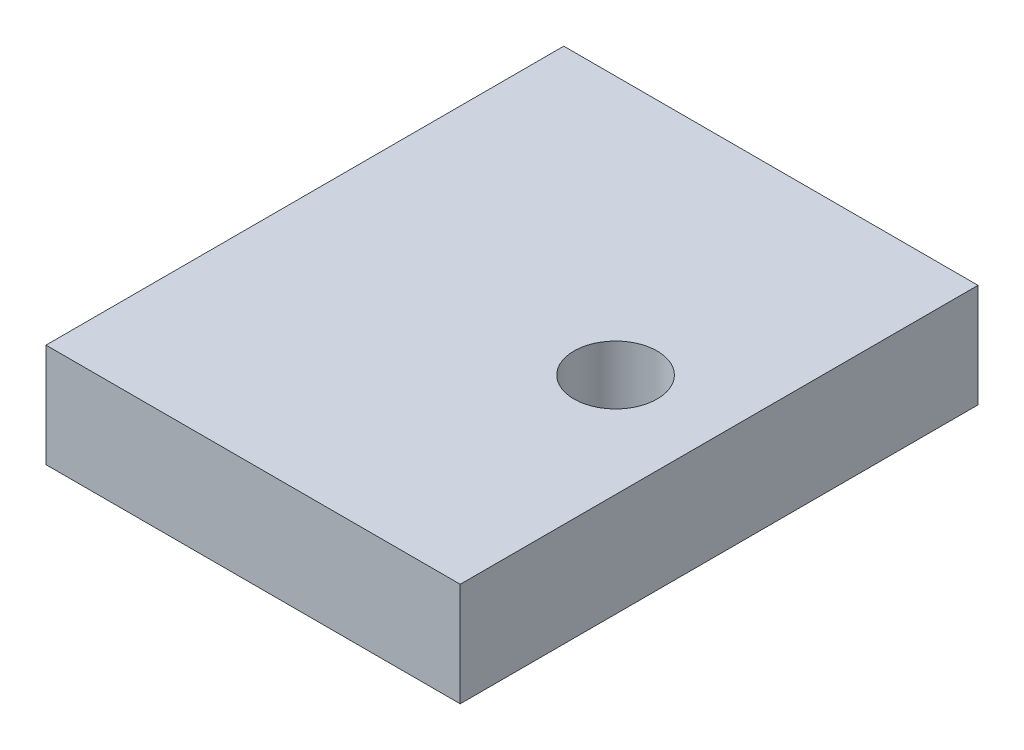
ISO-10303-21;
HEADER;
FILE_DESCRIPTION(('STEP AP214'),'2;1');
FILE_NAME('part.step','',(''),(''),'','','');
FILE_SCHEMA(('AUTOMOTIVE_DESIGN { 1 0 10303 214 1 1 1 1 }'));
ENDSEC;
DATA;
#1=APPLICATION_CONTEXT('core data for automotive mechanical design processes');
#2=APPLICATION_PROTOCOL_DEFINITION('international standard','automotive_design',2000,#1);
#3=PRODUCT_CONTEXT('',#1,'mechanical');
#4=PRODUCT('Part','Part','',(#3));
#5=PRODUCT_RELATED_PRODUCT_CATEGORY('part','',(#4));
#6=PRODUCT_DEFINITION_FORMATION('','',#4);
#7=PRODUCT_DEFINITION_CONTEXT('part definition',#1,'design');
#8=PRODUCT_DEFINITION('design','',#6,#7);
#9=PRODUCT_DEFINITION_SHAPE('','',#8);
#10=(LENGTH_UNIT() NAMED_UNIT(*) SI_UNIT(.MILLI.,.METRE.));
#11=(NAMED_UNIT(*) PLANE_ANGLE_UNIT() SI_UNIT($,.RADIAN.));
#12=(NAMED_UNIT(*) SI_UNIT($,.STERADIAN.) SOLID_ANGLE_UNIT());
#13=UNCERTAINTY_MEASURE_WITH_UNIT(LENGTH_MEASURE(1.E-05),#10,'distance_accuracy_value','');
#14=(GEOMETRIC_REPRESENTATION_CONTEXT(3) GLOBAL_UNCERTAINTY_ASSIGNED_CONTEXT((#13)) GLOBAL_UNIT_ASSIGNED_CONTEXT((#10,
#11,#12)) REPRESENTATION_CONTEXT('',''));
#15=CARTESIAN_POINT('',(0.,0.,0.));
#16=DIRECTION('',(0.,0.,1.));
#17=DIRECTION('',(1.,0.,0.));
#18=AXIS2_PLACEMENT_3D('',#15,#16,#17);
#19=CARTESIAN_POINT('',(25.4,6.35,0.));
#20=DIRECTION('',(1.,0.,0.));
#21=DIRECTION('',(0.,0.,-1.));
#22=AXIS2_PLACEMENT_3D('',#19,#20,#21);
#23=PLANE('',#22);
#24=DIRECTION('',(0.,0.,1.));
#25=VECTOR('',#24,1.);
#26=CARTESIAN_POINT('',(25.4,0.,0.));
#27=LINE('',#26,#25);
#28=CARTESIAN_POINT('',(25.4,0.,-31.75));
#29=VERTEX_POINT('',#28);
#30=CARTESIAN_POINT('',(25.4,0.,0.));
#31=VERTEX_POINT('',#30);
#32=EDGE_CURVE('E99',#29,#31,#27,.T.);
#33=ORIENTED_EDGE('',*,*,#32,.F.);
#34=DIRECTION('',(0.,-1.,0.));
#35=VECTOR('',#34,1.);
#36=CARTESIAN_POINT('',(25.4,6.35,-31.75));
#37=LINE('',#36,#35);
#38=CARTESIAN_POINT('',(25.4,6.35,-31.75));
#39=VERTEX_POINT('',#38);
#40=EDGE_CURVE('E11',#39,#29,#37,.T.);
#41=ORIENTED_EDGE('',*,*,#40,.F.);
#42=DIRECTION('',(0.,0.,1.));
#43=VECTOR('',#42,1.);
#44=CARTESIAN_POINT('',(25.4,6.35,0.));
#45=LINE('',#44,#43);
#46=CARTESIAN_POINT('',(25.4,6.35,0.));
#47=VERTEX_POINT('',#46);
#48=EDGE_CURVE('E92',#39,#47,#45,.T.);
#49=ORIENTED_EDGE('',*,*,#48,.T.);
#50=DIRECTION('',(0.,-1.,0.));
#51=VECTOR('',#50,1.);
#52=CARTESIAN_POINT('',(25.4,6.35,0.));
#53=LINE('',#52,#51);
#54=EDGE_CURVE('E74',#47,#31,#53,.T.);
#55=ORIENTED_EDGE('',*,*,#54,.T.);
#56=EDGE_LOOP('',(#33,#41,#49,#55));
#57=FACE_BOUND('',#56,.T.);
#58=ADVANCED_FACE('F36',(#57),#23,.T.);
#59=CARTESIAN_POINT('',(0.,6.35,-31.75));
#60=DIRECTION('',(0.,0.,-1.));
#61=DIRECTION('',(-1.,0.,0.));
#62=AXIS2_PLACEMENT_3D('',#59,#60,#61);
#63=PLANE('',#62);
#64=DIRECTION('',(1.,0.,0.));
#65=VECTOR('',#64,1.);
#66=CARTESIAN_POINT('',(0.,0.,-31.75));
#67=LINE('',#66,#65);
#68=CARTESIAN_POINT('',(0.,0.,-31.75));
#69=VERTEX_POINT('',#68);
#70=EDGE_CURVE('E85',#69,#29,#67,.T.);
#71=ORIENTED_EDGE('',*,*,#70,.F.);
#72=DIRECTION('',(0.,-1.,0.));
#73=VECTOR('',#72,1.);
#74=CARTESIAN_POINT('',(0.,6.35,-31.75));
#75=LINE('',#74,#73);
#76=CARTESIAN_POINT('',(0.,6.35,-31.75));
#77=VERTEX_POINT('',#76);
#78=EDGE_CURVE('E44',#77,#69,#75,.T.);
#79=ORIENTED_EDGE('',*,*,#78,.F.);
#80=DIRECTION('',(1.,0.,0.));
#81=VECTOR('',#80,1.);
#82=CARTESIAN_POINT('',(0.,6.35,-31.75));
#83=LINE('',#82,#81);
#84=EDGE_CURVE('E83',#77,#39,#83,.T.);
#85=ORIENTED_EDGE('',*,*,#84,.T.);
#86=ORIENTED_EDGE('',*,*,#40,.T.);
#87=EDGE_LOOP('',(#71,#79,#85,#86));
#88=FACE_BOUND('',#87,.T.);
#89=ADVANCED_FACE('F82',(#88),#63,.T.);
#90=CARTESIAN_POINT('',(0.,6.35,0.));
#91=DIRECTION('',(-1.,0.,0.));
#92=DIRECTION('',(0.,0.,1.));
#93=AXIS2_PLACEMENT_3D('',#90,#91,#92);
#94=PLANE('',#93);
#95=DIRECTION('',(0.,0.,-1.));
#96=VECTOR('',#95,1.);
#97=CARTESIAN_POINT('',(0.,0.,0.));
#98=LINE('',#97,#96);
#99=CARTESIAN_POINT('',(0.,0.,0.));
#100=VERTEX_POINT('',#99);
#101=EDGE_CURVE('E104',#100,#69,#98,.T.);
#102=ORIENTED_EDGE('',*,*,#101,.F.);
#103=DIRECTION('',(0.,-1.,0.));
#104=VECTOR('',#103,1.);
#105=CARTESIAN_POINT('',(0.,6.35,0.));
#106=LINE('',#105,#104);
#107=CARTESIAN_POINT('',(0.,6.35,0.));
#108=VERTEX_POINT('',#107);
#109=EDGE_CURVE('E67',#108,#100,#106,.T.);
#110=ORIENTED_EDGE('',*,*,#109,.F.);
#111=DIRECTION('',(0.,0.,-1.));
#112=VECTOR('',#111,1.);
#113=CARTESIAN_POINT('',(0.,6.35,0.));
#114=LINE('',#113,#112);
#115=EDGE_CURVE('E91',#108,#77,#114,.T.);
#116=ORIENTED_EDGE('',*,*,#115,.T.);
#117=ORIENTED_EDGE('',*,*,#78,.T.);
#118=EDGE_LOOP('',(#102,#110,#116,#117));
#119=FACE_BOUND('',#118,.T.);
#120=ADVANCED_FACE('F94',(#119),#94,.T.);
#121=CARTESIAN_POINT('',(0.,6.35,0.));
#122=DIRECTION('',(0.,0.,-1.));
#123=DIRECTION('',(-1.,0.,0.));
#124=AXIS2_PLACEMENT_3D('',#121,#122,#123);
#125=PLANE('',#124);
#126=DIRECTION('',(1.,0.,0.));
#127=VECTOR('',#126,1.);
#128=CARTESIAN_POINT('',(0.,0.,0.));
#129=LINE('',#128,#127);
#130=EDGE_CURVE('E106',#100,#31,#129,.T.);
#131=ORIENTED_EDGE('',*,*,#130,.T.);
#132=ORIENTED_EDGE('',*,*,#54,.F.);
#133=DIRECTION('',(1.,0.,0.));
#134=VECTOR('',#133,1.);
#135=CARTESIAN_POINT('',(0.,6.35,0.));
#136=LINE('',#135,#134);
#137=EDGE_CURVE('E52',#108,#47,#136,.T.);
#138=ORIENTED_EDGE('',*,*,#137,.F.);
#139=ORIENTED_EDGE('',*,*,#109,.T.);
#140=EDGE_LOOP('',(#131,#132,#138,#139));
#141=FACE_BOUND('',#140,.T.);
#142=ADVANCED_FACE('F121',(#141),#125,.F.);
#143=CARTESIAN_POINT('',(0.,6.35,0.));
#144=DIRECTION('',(0.,1.,0.));
#145=DIRECTION('',(0.,0.,1.));
#146=AXIS2_PLACEMENT_3D('',#143,#144,#145);
#147=PLANE('',#146);
#148=CARTESIAN_POINT('',(19.05,6.35,-15.875));
#149=DIRECTION('',(0.,1.,0.));
#150=DIRECTION('',(0.,0.,1.));
#151=AXIS2_PLACEMENT_3D('',#148,#149,#150);
#152=CIRCLE('',#151,2.55269999999999);
#153=CARTESIAN_POINT('',(19.05,6.35,-13.3223));
#154=VERTEX_POINT('',#153);
#155=EDGE_CURVE('E112',#154,#154,#152,.T.);
#156=ORIENTED_EDGE('',*,*,#155,.F.);
#157=EDGE_LOOP('',(#156));
#158=FACE_BOUND('',#157,.T.);
#159=ORIENTED_EDGE('',*,*,#48,.F.);
#160=ORIENTED_EDGE('',*,*,#84,.F.);
#161=ORIENTED_EDGE('',*,*,#115,.F.);
#162=ORIENTED_EDGE('',*,*,#137,.T.);
#163=EDGE_LOOP('',(#159,#160,#161,#162));
#164=FACE_BOUND('',#163,.T.);
#165=ADVANCED_FACE('F90',(#158,#164),#147,.T.);
#166=CARTESIAN_POINT('',(0.,0.,0.));
#167=DIRECTION('',(0.,1.,0.));
#168=DIRECTION('',(0.,0.,1.));
#169=AXIS2_PLACEMENT_3D('',#166,#167,#168);
#170=PLANE('',#169);
#171=CARTESIAN_POINT('',(19.05,0.,-15.875));
#172=DIRECTION('',(0.,1.,0.));
#173=DIRECTION('',(0.,0.,1.));
#174=AXIS2_PLACEMENT_3D('',#171,#172,#173);
#175=CIRCLE('',#174,2.55269999999999);
#176=CARTESIAN_POINT('',(19.05,0.,-13.3223));
#177=VERTEX_POINT('',#176);
#178=EDGE_CURVE('E102',#177,#177,#175,.T.);
#179=ORIENTED_EDGE('',*,*,#178,.T.);
#180=EDGE_LOOP('',(#179));
#181=FACE_BOUND('',#180,.T.);
#182=ORIENTED_EDGE('',*,*,#32,.T.);
#183=ORIENTED_EDGE('',*,*,#130,.F.);
#184=ORIENTED_EDGE('',*,*,#101,.T.);
#185=ORIENTED_EDGE('',*,*,#70,.T.);
#186=EDGE_LOOP('',(#182,#183,#184,#185));
#187=FACE_BOUND('',#186,.T.);
#188=ADVANCED_FACE('F120',(#181,#187),#170,.F.);
#189=CARTESIAN_POINT('',(19.05,6.35,-15.875));
#190=DIRECTION('',(0.,1.,0.));
#191=DIRECTION('',(0.,0.,1.));
#192=AXIS2_PLACEMENT_3D('',#189,#190,#191);
#193=CYLINDRICAL_SURFACE('',#192,2.55269999999999);
#194=ORIENTED_EDGE('',*,*,#155,.T.);
#195=EDGE_LOOP('',(#194));
#196=FACE_BOUND('',#195,.T.);
#197=ORIENTED_EDGE('',*,*,#178,.F.);
#198=EDGE_LOOP('',(#197));
#199=FACE_BOUND('',#198,.T.);
#200=ADVANCED_FACE('F116',(#196,#199),#193,.F.);
#201=CLOSED_SHELL('',(#58,#89,#120,#142,#165,#188,#200));
#202=MANIFOLD_SOLID_BREP('B2',#201);
#203=ADVANCED_BREP_SHAPE_REPRESENTATION('',(#18,#202),#14);
#204=SHAPE_DEFINITION_REPRESENTATION(#9,#203);
ENDSEC;
END-ISO-10303-21;
